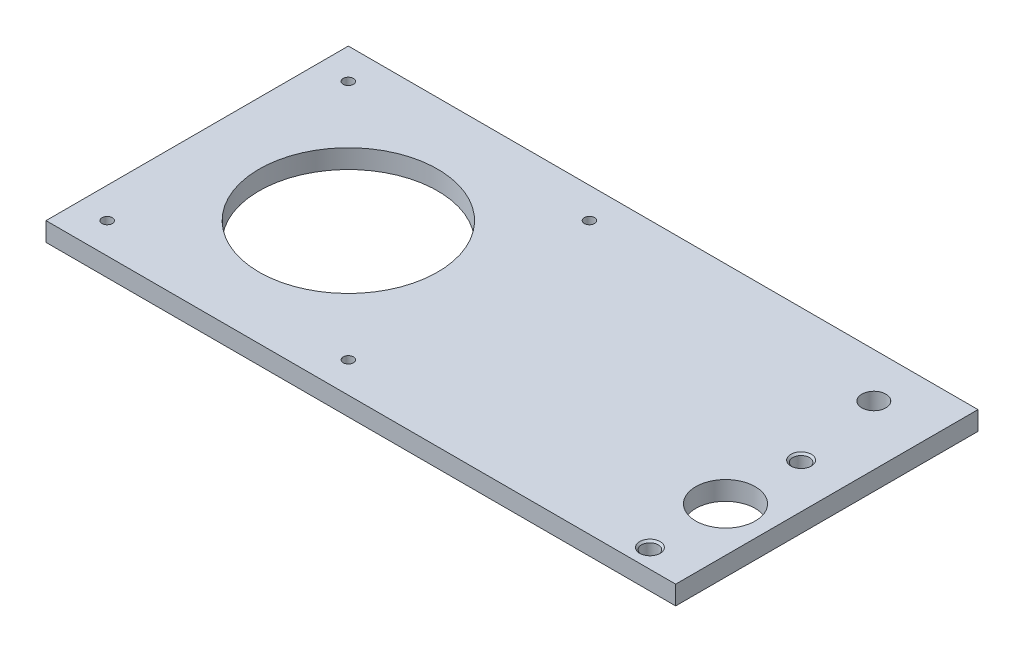
ISO-10303-21;
HEADER;
FILE_DESCRIPTION(('STEP AP214'),'2;1');
FILE_NAME('part.step','',(''),(''),'','','');
FILE_SCHEMA(('AUTOMOTIVE_DESIGN { 1 0 10303 214 1 1 1 1 }'));
ENDSEC;
DATA;
#1=APPLICATION_CONTEXT('core data for automotive mechanical design processes');
#2=APPLICATION_PROTOCOL_DEFINITION('international standard','automotive_design',2000,#1);
#3=PRODUCT_CONTEXT('',#1,'mechanical');
#4=PRODUCT('Part','Part','',(#3));
#5=PRODUCT_RELATED_PRODUCT_CATEGORY('part','',(#4));
#6=PRODUCT_DEFINITION_FORMATION('','',#4);
#7=PRODUCT_DEFINITION_CONTEXT('part definition',#1,'design');
#8=PRODUCT_DEFINITION('design','',#6,#7);
#9=PRODUCT_DEFINITION_SHAPE('','',#8);
#10=(LENGTH_UNIT() NAMED_UNIT(*) SI_UNIT(.MILLI.,.METRE.));
#11=(NAMED_UNIT(*) PLANE_ANGLE_UNIT() SI_UNIT($,.RADIAN.));
#12=(NAMED_UNIT(*) SI_UNIT($,.STERADIAN.) SOLID_ANGLE_UNIT());
#13=UNCERTAINTY_MEASURE_WITH_UNIT(LENGTH_MEASURE(1.E-05),#10,'distance_accuracy_value','');
#14=(GEOMETRIC_REPRESENTATION_CONTEXT(3) GLOBAL_UNCERTAINTY_ASSIGNED_CONTEXT((#13)) GLOBAL_UNIT_ASSIGNED_CONTEXT((#10,
#11,#12)) REPRESENTATION_CONTEXT('',''));
#15=CARTESIAN_POINT('',(0.,0.,0.));
#16=DIRECTION('',(0.,0.,1.));
#17=DIRECTION('',(1.,0.,0.));
#18=AXIS2_PLACEMENT_3D('',#15,#16,#17);
#19=CARTESIAN_POINT('',(0.,6.35,50.8));
#20=DIRECTION('',(0.,0.,-1.));
#21=DIRECTION('',(-1.,0.,0.));
#22=AXIS2_PLACEMENT_3D('',#19,#20,#21);
#23=PLANE('',#22);
#24=DIRECTION('',(1.,0.,0.));
#25=VECTOR('',#24,1.);
#26=CARTESIAN_POINT('',(0.,0.,50.8));
#27=LINE('',#26,#25);
#28=CARTESIAN_POINT('',(-50.8,0.,50.8));
#29=VERTEX_POINT('',#28);
#30=CARTESIAN_POINT('',(160.8,0.,50.8));
#31=VERTEX_POINT('',#30);
#32=EDGE_CURVE('E135',#29,#31,#27,.T.);
#33=ORIENTED_EDGE('',*,*,#32,.T.);
#34=DIRECTION('',(0.,-1.,0.));
#35=VECTOR('',#34,1.);
#36=CARTESIAN_POINT('',(160.8,6.35,50.8));
#37=LINE('',#36,#35);
#38=CARTESIAN_POINT('',(160.8,6.35,50.8));
#39=VERTEX_POINT('',#38);
#40=EDGE_CURVE('E11',#39,#31,#37,.T.);
#41=ORIENTED_EDGE('',*,*,#40,.F.);
#42=DIRECTION('',(1.,0.,0.));
#43=VECTOR('',#42,1.);
#44=CARTESIAN_POINT('',(0.,6.35,50.8));
#45=LINE('',#44,#43);
#46=CARTESIAN_POINT('',(-50.8,6.35,50.8));
#47=VERTEX_POINT('',#46);
#48=EDGE_CURVE('E93',#47,#39,#45,.T.);
#49=ORIENTED_EDGE('',*,*,#48,.F.);
#50=DIRECTION('',(0.,-1.,0.));
#51=VECTOR('',#50,1.);
#52=CARTESIAN_POINT('',(-50.8,6.35,50.8));
#53=LINE('',#52,#51);
#54=EDGE_CURVE('E130',#47,#29,#53,.T.);
#55=ORIENTED_EDGE('',*,*,#54,.T.);
#56=EDGE_LOOP('',(#33,#41,#49,#55));
#57=FACE_BOUND('',#56,.T.);
#58=ADVANCED_FACE('F52',(#57),#23,.F.);
#59=CARTESIAN_POINT('',(160.8,6.35,0.));
#60=DIRECTION('',(1.,0.,0.));
#61=DIRECTION('',(0.,0.,-1.));
#62=AXIS2_PLACEMENT_3D('',#59,#60,#61);
#63=PLANE('',#62);
#64=DIRECTION('',(0.,0.,1.));
#65=VECTOR('',#64,1.);
#66=CARTESIAN_POINT('',(160.8,0.,0.));
#67=LINE('',#66,#65);
#68=CARTESIAN_POINT('',(160.8,0.,-50.8));
#69=VERTEX_POINT('',#68);
#70=EDGE_CURVE('E102',#69,#31,#67,.T.);
#71=ORIENTED_EDGE('',*,*,#70,.F.);
#72=DIRECTION('',(0.,-1.,0.));
#73=VECTOR('',#72,1.);
#74=CARTESIAN_POINT('',(160.8,6.35,-50.8));
#75=LINE('',#74,#73);
#76=CARTESIAN_POINT('',(160.8,6.35,-50.8));
#77=VERTEX_POINT('',#76);
#78=EDGE_CURVE('E62',#77,#69,#75,.T.);
#79=ORIENTED_EDGE('',*,*,#78,.F.);
#80=DIRECTION('',(0.,0.,1.));
#81=VECTOR('',#80,1.);
#82=CARTESIAN_POINT('',(160.8,6.35,0.));
#83=LINE('',#82,#81);
#84=EDGE_CURVE('E100',#77,#39,#83,.T.);
#85=ORIENTED_EDGE('',*,*,#84,.T.);
#86=ORIENTED_EDGE('',*,*,#40,.T.);
#87=EDGE_LOOP('',(#71,#79,#85,#86));
#88=FACE_BOUND('',#87,.T.);
#89=ADVANCED_FACE('F99',(#88),#63,.T.);
#90=CARTESIAN_POINT('',(0.,6.35,-50.8));
#91=DIRECTION('',(0.,0.,-1.));
#92=DIRECTION('',(-1.,0.,0.));
#93=AXIS2_PLACEMENT_3D('',#90,#91,#92);
#94=PLANE('',#93);
#95=DIRECTION('',(1.,0.,0.));
#96=VECTOR('',#95,1.);
#97=CARTESIAN_POINT('',(0.,0.,-50.8));
#98=LINE('',#97,#96);
#99=CARTESIAN_POINT('',(-50.8,0.,-50.8));
#100=VERTEX_POINT('',#99);
#101=EDGE_CURVE('E142',#100,#69,#98,.T.);
#102=ORIENTED_EDGE('',*,*,#101,.F.);
#103=DIRECTION('',(0.,-1.,0.));
#104=VECTOR('',#103,1.);
#105=CARTESIAN_POINT('',(-50.8,6.35,-50.8));
#106=LINE('',#105,#104);
#107=CARTESIAN_POINT('',(-50.8,6.35,-50.8));
#108=VERTEX_POINT('',#107);
#109=EDGE_CURVE('E85',#108,#100,#106,.T.);
#110=ORIENTED_EDGE('',*,*,#109,.F.);
#111=DIRECTION('',(1.,0.,0.));
#112=VECTOR('',#111,1.);
#113=CARTESIAN_POINT('',(0.,6.35,-50.8));
#114=LINE('',#113,#112);
#115=EDGE_CURVE('E110',#108,#77,#114,.T.);
#116=ORIENTED_EDGE('',*,*,#115,.T.);
#117=ORIENTED_EDGE('',*,*,#78,.T.);
#118=EDGE_LOOP('',(#102,#110,#116,#117));
#119=FACE_BOUND('',#118,.T.);
#120=ADVANCED_FACE('F113',(#119),#94,.T.);
#121=CARTESIAN_POINT('',(145.8,6.35,19.05));
#122=DIRECTION('',(0.,-1.,0.));
#123=DIRECTION('',(0.,0.,-1.));
#124=AXIS2_PLACEMENT_3D('',#121,#122,#123);
#125=CYLINDRICAL_SURFACE('',#124,9.99999999999998);
#126=CARTESIAN_POINT('',(145.8,6.35,19.05));
#127=DIRECTION('',(0.,1.,0.));
#128=DIRECTION('',(0.,0.,1.));
#129=AXIS2_PLACEMENT_3D('',#126,#127,#128);
#130=CIRCLE('',#129,9.99999999999998);
#131=CARTESIAN_POINT('',(145.8,6.35,29.05));
#132=VERTEX_POINT('',#131);
#133=EDGE_CURVE('E119',#132,#132,#130,.T.);
#134=ORIENTED_EDGE('',*,*,#133,.T.);
#135=EDGE_LOOP('',(#134));
#136=FACE_BOUND('',#135,.T.);
#137=CARTESIAN_POINT('',(145.8,0.,19.05));
#138=DIRECTION('',(0.,1.,0.));
#139=DIRECTION('',(0.,0.,1.));
#140=AXIS2_PLACEMENT_3D('',#137,#138,#139);
#141=CIRCLE('',#140,9.99999999999998);
#142=CARTESIAN_POINT('',(145.8,0.,29.05));
#143=VERTEX_POINT('',#142);
#144=EDGE_CURVE('E147',#143,#143,#141,.T.);
#145=ORIENTED_EDGE('',*,*,#144,.F.);
#146=EDGE_LOOP('',(#145));
#147=FACE_BOUND('',#146,.T.);
#148=ADVANCED_FACE('F330',(#136,#147),#125,.F.);
#149=CARTESIAN_POINT('',(-50.8,6.35,0.));
#150=DIRECTION('',(1.,0.,0.));
#151=DIRECTION('',(0.,0.,-1.));
#152=AXIS2_PLACEMENT_3D('',#149,#150,#151);
#153=PLANE('',#152);
#154=DIRECTION('',(0.,0.,1.));
#155=VECTOR('',#154,1.);
#156=CARTESIAN_POINT('',(-50.8,0.,0.));
#157=LINE('',#156,#155);
#158=EDGE_CURVE('E88',#100,#29,#157,.T.);
#159=ORIENTED_EDGE('',*,*,#158,.T.);
#160=ORIENTED_EDGE('',*,*,#54,.F.);
#161=DIRECTION('',(0.,0.,1.));
#162=VECTOR('',#161,1.);
#163=CARTESIAN_POINT('',(-50.8,6.35,0.));
#164=LINE('',#163,#162);
#165=EDGE_CURVE('E70',#108,#47,#164,.T.);
#166=ORIENTED_EDGE('',*,*,#165,.F.);
#167=ORIENTED_EDGE('',*,*,#109,.T.);
#168=EDGE_LOOP('',(#159,#160,#166,#167));
#169=FACE_BOUND('',#168,.T.);
#170=ADVANCED_FACE('F301',(#169),#153,.F.);
#171=CARTESIAN_POINT('',(0.,6.35,0.));
#172=DIRECTION('',(0.,-1.,0.));
#173=DIRECTION('',(0.,0.,-1.));
#174=AXIS2_PLACEMENT_3D('',#171,#172,#173);
#175=CYLINDRICAL_SURFACE('',#174,30.);
#176=CARTESIAN_POINT('',(0.,6.35,0.));
#177=DIRECTION('',(0.,1.,0.));
#178=DIRECTION('',(0.,0.,1.));
#179=AXIS2_PLACEMENT_3D('',#176,#177,#178);
#180=CIRCLE('',#179,30.);
#181=CARTESIAN_POINT('',(0.,6.35,30.));
#182=VERTEX_POINT('',#181);
#183=EDGE_CURVE('E155',#182,#182,#180,.T.);
#184=ORIENTED_EDGE('',*,*,#183,.T.);
#185=EDGE_LOOP('',(#184));
#186=FACE_BOUND('',#185,.T.);
#187=CARTESIAN_POINT('',(0.,0.,0.));
#188=DIRECTION('',(0.,1.,0.));
#189=DIRECTION('',(0.,0.,1.));
#190=AXIS2_PLACEMENT_3D('',#187,#188,#189);
#191=CIRCLE('',#190,30.);
#192=CARTESIAN_POINT('',(0.,0.,30.));
#193=VERTEX_POINT('',#192);
#194=EDGE_CURVE('E131',#193,#193,#191,.T.);
#195=ORIENTED_EDGE('',*,*,#194,.F.);
#196=EDGE_LOOP('',(#195));
#197=FACE_BOUND('',#196,.T.);
#198=ADVANCED_FACE('F54',(#186,#197),#175,.F.);
#199=CARTESIAN_POINT('',(140.8,6.35,-35.8));
#200=DIRECTION('',(0.,-1.,0.));
#201=DIRECTION('',(0.,0.,-1.));
#202=AXIS2_PLACEMENT_3D('',#199,#200,#201);
#203=CYLINDRICAL_SURFACE('',#202,4.025);
#204=CARTESIAN_POINT('',(140.8,6.35,-35.8));
#205=DIRECTION('',(0.,1.,0.));
#206=DIRECTION('',(0.,0.,1.));
#207=AXIS2_PLACEMENT_3D('',#204,#205,#206);
#208=CIRCLE('',#207,4.025);
#209=CARTESIAN_POINT('',(140.8,6.35,-31.775));
#210=VERTEX_POINT('',#209);
#211=EDGE_CURVE('E126',#210,#210,#208,.T.);
#212=ORIENTED_EDGE('',*,*,#211,.T.);
#213=EDGE_LOOP('',(#212));
#214=FACE_BOUND('',#213,.T.);
#215=CARTESIAN_POINT('',(140.8,0.,-35.8));
#216=DIRECTION('',(0.,1.,0.));
#217=DIRECTION('',(0.,0.,1.));
#218=AXIS2_PLACEMENT_3D('',#215,#216,#217);
#219=CIRCLE('',#218,4.025);
#220=CARTESIAN_POINT('',(140.8,0.,-31.775));
#221=VERTEX_POINT('',#220);
#222=EDGE_CURVE('E151',#221,#221,#219,.T.);
#223=ORIENTED_EDGE('',*,*,#222,.F.);
#224=EDGE_LOOP('',(#223));
#225=FACE_BOUND('',#224,.T.);
#226=ADVANCED_FACE('F285',(#214,#225),#203,.F.);
#227=CARTESIAN_POINT('',(0.,6.35,0.));
#228=DIRECTION('',(0.,1.,0.));
#229=DIRECTION('',(0.,0.,1.));
#230=AXIS2_PLACEMENT_3D('',#227,#228,#229);
#231=PLANE('',#230);
#232=CARTESIAN_POINT('',(145.8,6.35,-6.34999999999999));
#233=DIRECTION('',(0.,1.,0.));
#234=DIRECTION('',(0.,0.,1.));
#235=AXIS2_PLACEMENT_3D('',#232,#233,#234);
#236=CIRCLE('',#235,3.44169999999999);
#237=CARTESIAN_POINT('',(145.8,6.35,-2.9083));
#238=VERTEX_POINT('',#237);
#239=EDGE_CURVE('E271',#238,#238,#236,.T.);
#240=ORIENTED_EDGE('',*,*,#239,.F.);
#241=EDGE_LOOP('',(#240));
#242=FACE_BOUND('',#241,.T.);
#243=CARTESIAN_POINT('',(145.8,6.35,44.45));
#244=DIRECTION('',(0.,1.,0.));
#245=DIRECTION('',(0.,0.,1.));
#246=AXIS2_PLACEMENT_3D('',#243,#244,#245);
#247=CIRCLE('',#246,3.44169999999999);
#248=CARTESIAN_POINT('',(145.8,6.35,47.8917));
#249=VERTEX_POINT('',#248);
#250=EDGE_CURVE('E253',#249,#249,#247,.T.);
#251=ORIENTED_EDGE('',*,*,#250,.F.);
#252=EDGE_LOOP('',(#251));
#253=FACE_BOUND('',#252,.T.);
#254=CARTESIAN_POINT('',(-40.513,6.35,-40.513));
#255=DIRECTION('',(0.,1.,0.));
#256=DIRECTION('',(0.,0.,1.));
#257=AXIS2_PLACEMENT_3D('',#254,#255,#256);
#258=CIRCLE('',#257,1.7272);
#259=CARTESIAN_POINT('',(-40.513,6.35,-38.7858));
#260=VERTEX_POINT('',#259);
#261=EDGE_CURVE('E235',#260,#260,#258,.T.);
#262=ORIENTED_EDGE('',*,*,#261,.F.);
#263=EDGE_LOOP('',(#262));
#264=FACE_BOUND('',#263,.T.);
#265=CARTESIAN_POINT('',(40.513,6.35,-40.513));
#266=DIRECTION('',(0.,1.,0.));
#267=DIRECTION('',(0.,0.,1.));
#268=AXIS2_PLACEMENT_3D('',#265,#266,#267);
#269=CIRCLE('',#268,1.7272);
#270=CARTESIAN_POINT('',(40.513,6.35,-38.7858));
#271=VERTEX_POINT('',#270);
#272=EDGE_CURVE('E223',#271,#271,#269,.T.);
#273=ORIENTED_EDGE('',*,*,#272,.F.);
#274=EDGE_LOOP('',(#273));
#275=FACE_BOUND('',#274,.T.);
#276=CARTESIAN_POINT('',(40.513,6.35,40.513));
#277=DIRECTION('',(0.,1.,0.));
#278=DIRECTION('',(0.,0.,1.));
#279=AXIS2_PLACEMENT_3D('',#276,#277,#278);
#280=CIRCLE('',#279,1.7272);
#281=CARTESIAN_POINT('',(40.513,6.35,42.2402));
#282=VERTEX_POINT('',#281);
#283=EDGE_CURVE('E211',#282,#282,#280,.T.);
#284=ORIENTED_EDGE('',*,*,#283,.F.);
#285=EDGE_LOOP('',(#284));
#286=FACE_BOUND('',#285,.T.);
#287=CARTESIAN_POINT('',(-40.513,6.35,40.513));
#288=DIRECTION('',(0.,1.,0.));
#289=DIRECTION('',(0.,0.,1.));
#290=AXIS2_PLACEMENT_3D('',#287,#288,#289);
#291=CIRCLE('',#290,1.7272);
#292=CARTESIAN_POINT('',(-40.513,6.35,42.2402));
#293=VERTEX_POINT('',#292);
#294=EDGE_CURVE('E199',#293,#293,#291,.T.);
#295=ORIENTED_EDGE('',*,*,#294,.F.);
#296=EDGE_LOOP('',(#295));
#297=FACE_BOUND('',#296,.T.);
#298=ORIENTED_EDGE('',*,*,#183,.F.);
#299=EDGE_LOOP('',(#298));
#300=FACE_BOUND('',#299,.T.);
#301=ORIENTED_EDGE('',*,*,#48,.T.);
#302=ORIENTED_EDGE('',*,*,#84,.F.);
#303=ORIENTED_EDGE('',*,*,#115,.F.);
#304=ORIENTED_EDGE('',*,*,#165,.T.);
#305=EDGE_LOOP('',(#301,#302,#303,#304));
#306=FACE_BOUND('',#305,.T.);
#307=ORIENTED_EDGE('',*,*,#133,.F.);
#308=EDGE_LOOP('',(#307));
#309=FACE_BOUND('',#308,.T.);
#310=ORIENTED_EDGE('',*,*,#211,.F.);
#311=EDGE_LOOP('',(#310));
#312=FACE_BOUND('',#311,.T.);
#313=ADVANCED_FACE('F108',(#242,#253,#264,#275,#286,#297,#300,#306,#309,#312),#231,.T.);
#314=CARTESIAN_POINT('',(0.,0.,0.));
#315=DIRECTION('',(0.,1.,0.));
#316=DIRECTION('',(0.,0.,1.));
#317=AXIS2_PLACEMENT_3D('',#314,#315,#316);
#318=PLANE('',#317);
#319=CARTESIAN_POINT('',(145.8,0.,-6.34999999999999));
#320=DIRECTION('',(0.,1.,0.));
#321=DIRECTION('',(0.,0.,1.));
#322=AXIS2_PLACEMENT_3D('',#319,#320,#321);
#323=CIRCLE('',#322,2.8067);
#324=CARTESIAN_POINT('',(145.8,0.,-3.5433));
#325=VERTEX_POINT('',#324);
#326=EDGE_CURVE('E259',#325,#325,#323,.T.);
#327=ORIENTED_EDGE('',*,*,#326,.T.);
#328=EDGE_LOOP('',(#327));
#329=FACE_BOUND('',#328,.T.);
#330=CARTESIAN_POINT('',(145.8,0.,44.45));
#331=DIRECTION('',(0.,1.,0.));
#332=DIRECTION('',(0.,0.,1.));
#333=AXIS2_PLACEMENT_3D('',#330,#331,#332);
#334=CIRCLE('',#333,2.8067);
#335=CARTESIAN_POINT('',(145.8,0.,47.2567));
#336=VERTEX_POINT('',#335);
#337=EDGE_CURVE('E241',#336,#336,#334,.T.);
#338=ORIENTED_EDGE('',*,*,#337,.T.);
#339=EDGE_LOOP('',(#338));
#340=FACE_BOUND('',#339,.T.);
#341=CARTESIAN_POINT('',(-40.513,0.,-40.513));
#342=DIRECTION('',(0.,1.,0.));
#343=DIRECTION('',(0.,0.,1.));
#344=AXIS2_PLACEMENT_3D('',#341,#342,#343);
#345=CIRCLE('',#344,1.7272);
#346=CARTESIAN_POINT('',(-40.513,0.,-38.7858));
#347=VERTEX_POINT('',#346);
#348=EDGE_CURVE('E229',#347,#347,#345,.T.);
#349=ORIENTED_EDGE('',*,*,#348,.T.);
#350=EDGE_LOOP('',(#349));
#351=FACE_BOUND('',#350,.T.);
#352=CARTESIAN_POINT('',(40.513,0.,-40.513));
#353=DIRECTION('',(0.,1.,0.));
#354=DIRECTION('',(0.,0.,1.));
#355=AXIS2_PLACEMENT_3D('',#352,#353,#354);
#356=CIRCLE('',#355,1.7272);
#357=CARTESIAN_POINT('',(40.513,0.,-38.7858));
#358=VERTEX_POINT('',#357);
#359=EDGE_CURVE('E217',#358,#358,#356,.T.);
#360=ORIENTED_EDGE('',*,*,#359,.T.);
#361=EDGE_LOOP('',(#360));
#362=FACE_BOUND('',#361,.T.);
#363=CARTESIAN_POINT('',(40.513,0.,40.513));
#364=DIRECTION('',(0.,1.,0.));
#365=DIRECTION('',(0.,0.,1.));
#366=AXIS2_PLACEMENT_3D('',#363,#364,#365);
#367=CIRCLE('',#366,1.7272);
#368=CARTESIAN_POINT('',(40.513,0.,42.2402));
#369=VERTEX_POINT('',#368);
#370=EDGE_CURVE('E205',#369,#369,#367,.T.);
#371=ORIENTED_EDGE('',*,*,#370,.T.);
#372=EDGE_LOOP('',(#371));
#373=FACE_BOUND('',#372,.T.);
#374=CARTESIAN_POINT('',(-40.513,0.,40.513));
#375=DIRECTION('',(0.,1.,0.));
#376=DIRECTION('',(0.,0.,1.));
#377=AXIS2_PLACEMENT_3D('',#374,#375,#376);
#378=CIRCLE('',#377,1.7272);
#379=CARTESIAN_POINT('',(-40.513,0.,42.2402));
#380=VERTEX_POINT('',#379);
#381=EDGE_CURVE('E136',#380,#380,#378,.T.);
#382=ORIENTED_EDGE('',*,*,#381,.T.);
#383=EDGE_LOOP('',(#382));
#384=FACE_BOUND('',#383,.T.);
#385=ORIENTED_EDGE('',*,*,#194,.T.);
#386=EDGE_LOOP('',(#385));
#387=FACE_BOUND('',#386,.T.);
#388=ORIENTED_EDGE('',*,*,#32,.F.);
#389=ORIENTED_EDGE('',*,*,#158,.F.);
#390=ORIENTED_EDGE('',*,*,#101,.T.);
#391=ORIENTED_EDGE('',*,*,#70,.T.);
#392=EDGE_LOOP('',(#388,#389,#390,#391));
#393=FACE_BOUND('',#392,.T.);
#394=ORIENTED_EDGE('',*,*,#144,.T.);
#395=EDGE_LOOP('',(#394));
#396=FACE_BOUND('',#395,.T.);
#397=ORIENTED_EDGE('',*,*,#222,.T.);
#398=EDGE_LOOP('',(#397));
#399=FACE_BOUND('',#398,.T.);
#400=ADVANCED_FACE('F284',(#329,#340,#351,#362,#373,#384,#387,#393,#396,#399),#318,.F.);
#401=CARTESIAN_POINT('',(-40.513,6.35,40.513));
#402=DIRECTION('',(0.,1.,0.));
#403=DIRECTION('',(0.,0.,1.));
#404=AXIS2_PLACEMENT_3D('',#401,#402,#403);
#405=CYLINDRICAL_SURFACE('',#404,1.7272);
#406=ORIENTED_EDGE('',*,*,#381,.F.);
#407=EDGE_LOOP('',(#406));
#408=FACE_BOUND('',#407,.T.);
#409=ORIENTED_EDGE('',*,*,#294,.T.);
#410=EDGE_LOOP('',(#409));
#411=FACE_BOUND('',#410,.T.);
#412=ADVANCED_FACE('F306',(#408,#411),#405,.F.);
#413=CARTESIAN_POINT('',(40.513,6.35,40.513));
#414=DIRECTION('',(0.,1.,0.));
#415=DIRECTION('',(0.,0.,1.));
#416=AXIS2_PLACEMENT_3D('',#413,#414,#415);
#417=CYLINDRICAL_SURFACE('',#416,1.7272);
#418=ORIENTED_EDGE('',*,*,#370,.F.);
#419=EDGE_LOOP('',(#418));
#420=FACE_BOUND('',#419,.T.);
#421=ORIENTED_EDGE('',*,*,#283,.T.);
#422=EDGE_LOOP('',(#421));
#423=FACE_BOUND('',#422,.T.);
#424=ADVANCED_FACE('F371',(#420,#423),#417,.F.);
#425=CARTESIAN_POINT('',(40.513,6.35,-40.513));
#426=DIRECTION('',(0.,1.,0.));
#427=DIRECTION('',(0.,0.,1.));
#428=AXIS2_PLACEMENT_3D('',#425,#426,#427);
#429=CYLINDRICAL_SURFACE('',#428,1.7272);
#430=ORIENTED_EDGE('',*,*,#359,.F.);
#431=EDGE_LOOP('',(#430));
#432=FACE_BOUND('',#431,.T.);
#433=ORIENTED_EDGE('',*,*,#272,.T.);
#434=EDGE_LOOP('',(#433));
#435=FACE_BOUND('',#434,.T.);
#436=ADVANCED_FACE('F379',(#432,#435),#429,.F.);
#437=CARTESIAN_POINT('',(-40.513,6.35,-40.513));
#438=DIRECTION('',(0.,1.,0.));
#439=DIRECTION('',(0.,0.,1.));
#440=AXIS2_PLACEMENT_3D('',#437,#438,#439);
#441=CYLINDRICAL_SURFACE('',#440,1.7272);
#442=ORIENTED_EDGE('',*,*,#348,.F.);
#443=EDGE_LOOP('',(#442));
#444=FACE_BOUND('',#443,.T.);
#445=ORIENTED_EDGE('',*,*,#261,.T.);
#446=EDGE_LOOP('',(#445));
#447=FACE_BOUND('',#446,.T.);
#448=ADVANCED_FACE('F387',(#444,#447),#441,.F.);
#449=CARTESIAN_POINT('',(145.8,6.35,44.45));
#450=DIRECTION('',(0.,1.,0.));
#451=DIRECTION('',(0.,0.,1.));
#452=AXIS2_PLACEMENT_3D('',#449,#450,#451);
#453=CYLINDRICAL_SURFACE('',#452,2.8067);
#454=ORIENTED_EDGE('',*,*,#337,.F.);
#455=EDGE_LOOP('',(#454));
#456=FACE_BOUND('',#455,.T.);
#457=CARTESIAN_POINT('',(145.8,5.715,44.45));
#458=DIRECTION('',(0.,1.,0.));
#459=DIRECTION('',(0.,0.,1.));
#460=AXIS2_PLACEMENT_3D('',#457,#458,#459);
#461=CIRCLE('',#460,2.8067);
#462=CARTESIAN_POINT('',(145.8,5.715,47.2567));
#463=VERTEX_POINT('',#462);
#464=EDGE_CURVE('E247',#463,#463,#461,.T.);
#465=ORIENTED_EDGE('',*,*,#464,.T.);
#466=EDGE_LOOP('',(#465));
#467=FACE_BOUND('',#466,.T.);
#468=ADVANCED_FACE('F395',(#456,#467),#453,.F.);
#469=CARTESIAN_POINT('',(145.8,6.35,44.45));
#470=DIRECTION('',(0.,1.,0.));
#471=DIRECTION('',(0.,0.,1.));
#472=AXIS2_PLACEMENT_3D('',#469,#470,#471);
#473=CONICAL_SURFACE('',#472,3.44169999999999,0.785398163397443);
#474=ORIENTED_EDGE('',*,*,#464,.F.);
#475=EDGE_LOOP('',(#474));
#476=FACE_BOUND('',#475,.T.);
#477=ORIENTED_EDGE('',*,*,#250,.T.);
#478=EDGE_LOOP('',(#477));
#479=FACE_BOUND('',#478,.T.);
#480=ADVANCED_FACE('F402',(#476,#479),#473,.F.);
#481=CARTESIAN_POINT('',(145.8,6.35,-6.34999999999999));
#482=DIRECTION('',(0.,1.,0.));
#483=DIRECTION('',(0.,0.,1.));
#484=AXIS2_PLACEMENT_3D('',#481,#482,#483);
#485=CYLINDRICAL_SURFACE('',#484,2.8067);
#486=ORIENTED_EDGE('',*,*,#326,.F.);
#487=EDGE_LOOP('',(#486));
#488=FACE_BOUND('',#487,.T.);
#489=CARTESIAN_POINT('',(145.8,5.715,-6.34999999999999));
#490=DIRECTION('',(0.,1.,0.));
#491=DIRECTION('',(0.,0.,1.));
#492=AXIS2_PLACEMENT_3D('',#489,#490,#491);
#493=CIRCLE('',#492,2.8067);
#494=CARTESIAN_POINT('',(145.8,5.715,-3.5433));
#495=VERTEX_POINT('',#494);
#496=EDGE_CURVE('E265',#495,#495,#493,.T.);
#497=ORIENTED_EDGE('',*,*,#496,.T.);
#498=EDGE_LOOP('',(#497));
#499=FACE_BOUND('',#498,.T.);
#500=ADVANCED_FACE('F410',(#488,#499),#485,.F.);
#501=CARTESIAN_POINT('',(145.8,6.35,-6.34999999999999));
#502=DIRECTION('',(0.,1.,0.));
#503=DIRECTION('',(0.,0.,1.));
#504=AXIS2_PLACEMENT_3D('',#501,#502,#503);
#505=CONICAL_SURFACE('',#504,3.44169999999999,0.785398163397443);
#506=ORIENTED_EDGE('',*,*,#496,.F.);
#507=EDGE_LOOP('',(#506));
#508=FACE_BOUND('',#507,.T.);
#509=ORIENTED_EDGE('',*,*,#239,.T.);
#510=EDGE_LOOP('',(#509));
#511=FACE_BOUND('',#510,.T.);
#512=ADVANCED_FACE('F280',(#508,#511),#505,.F.);
#513=CLOSED_SHELL('',(#58,#89,#120,#148,#170,#198,#226,#313,#400,#412,#424,#436,#448,#468,#480,
#500,#512));
#514=MANIFOLD_SOLID_BREP('B2',#513);
#515=ADVANCED_BREP_SHAPE_REPRESENTATION('',(#18,#514),#14);
#516=SHAPE_DEFINITION_REPRESENTATION(#9,#515);
ENDSEC;
END-ISO-10303-21;
